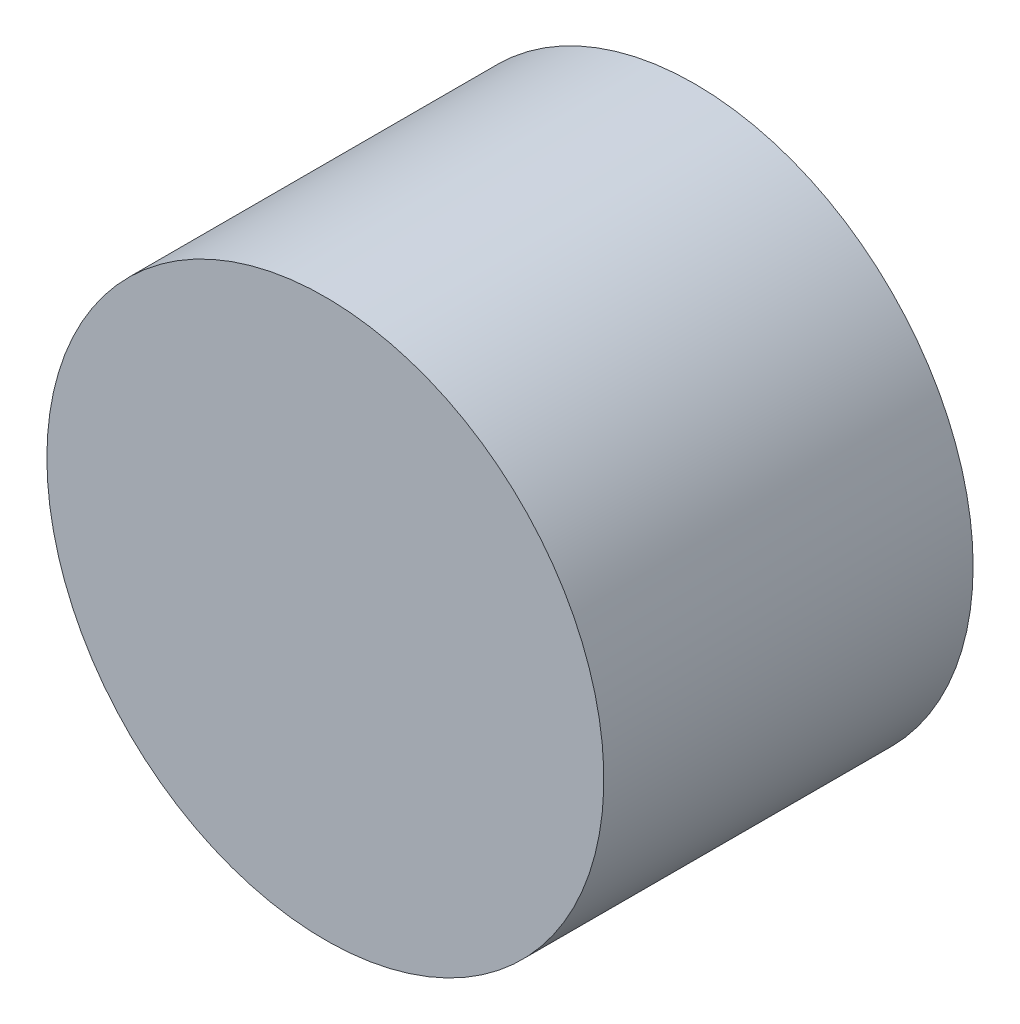
ISO-10303-21;
HEADER;
FILE_DESCRIPTION(('STEP AP214'),'2;1');
FILE_NAME('part.step','',(''),(''),'','','');
FILE_SCHEMA(('AUTOMOTIVE_DESIGN { 1 0 10303 214 1 1 1 1 }'));
ENDSEC;
DATA;
#1=APPLICATION_CONTEXT('core data for automotive mechanical design processes');
#2=APPLICATION_PROTOCOL_DEFINITION('international standard','automotive_design',2000,#1);
#3=PRODUCT_CONTEXT('',#1,'mechanical');
#4=PRODUCT('Part','Part','',(#3));
#5=PRODUCT_RELATED_PRODUCT_CATEGORY('part','',(#4));
#6=PRODUCT_DEFINITION_FORMATION('','',#4);
#7=PRODUCT_DEFINITION_CONTEXT('part definition',#1,'design');
#8=PRODUCT_DEFINITION('design','',#6,#7);
#9=PRODUCT_DEFINITION_SHAPE('','',#8);
#10=(LENGTH_UNIT() NAMED_UNIT(*) SI_UNIT(.MILLI.,.METRE.));
#11=(NAMED_UNIT(*) PLANE_ANGLE_UNIT() SI_UNIT($,.RADIAN.));
#12=(NAMED_UNIT(*) SI_UNIT($,.STERADIAN.) SOLID_ANGLE_UNIT());
#13=UNCERTAINTY_MEASURE_WITH_UNIT(LENGTH_MEASURE(1.E-05),#10,'distance_accuracy_value','');
#14=(GEOMETRIC_REPRESENTATION_CONTEXT(3) GLOBAL_UNCERTAINTY_ASSIGNED_CONTEXT((#13)) GLOBAL_UNIT_ASSIGNED_CONTEXT((#10,
#11,#12)) REPRESENTATION_CONTEXT('',''));
#15=CARTESIAN_POINT('',(0.,0.,0.));
#16=DIRECTION('',(0.,0.,1.));
#17=DIRECTION('',(1.,0.,0.));
#18=AXIS2_PLACEMENT_3D('',#15,#16,#17);
#19=CARTESIAN_POINT('',(-8.76300000000001,-27.305,-1.651));
#20=DIRECTION('',(0.,0.,1.));
#21=DIRECTION('',(1.,0.,0.));
#22=AXIS2_PLACEMENT_3D('',#19,#20,#21);
#23=CYLINDRICAL_SURFACE('',#22,1.778);
#24=CARTESIAN_POINT('',(-8.76300000000001,-27.305,-1.651));
#25=DIRECTION('',(0.,0.,1.));
#26=DIRECTION('',(1.,0.,0.));
#27=AXIS2_PLACEMENT_3D('',#24,#25,#26);
#28=CIRCLE('',#27,1.778);
#29=CARTESIAN_POINT('',(-6.98500000000001,-27.305,-1.651));
#30=VERTEX_POINT('',#29);
#31=EDGE_CURVE('E10',#30,#30,#28,.T.);
#32=CARTESIAN_POINT('',(-8.76300000000001,-27.305,0.));
#33=DIRECTION('',(0.,0.,1.));
#34=DIRECTION('',(1.,0.,0.));
#35=AXIS2_PLACEMENT_3D('',#32,#33,#34);
#36=CIRCLE('',#35,1.778);
#37=CARTESIAN_POINT('',(-6.98500000000001,-27.305,0.));
#38=VERTEX_POINT('',#37);
#39=EDGE_CURVE('E33',#38,#38,#36,.T.);
#40=CARTESIAN_POINT('',(-6.98500000000001,-27.305,-1.651));
#41=CARTESIAN_POINT('',(-6.98500000000001,-27.305,-1.63380208333333));
#42=CARTESIAN_POINT('',(-6.98500000000001,-27.305,-1.61660416666667));
#43=CARTESIAN_POINT('',(-6.98500000000001,-27.305,-1.58220833333333));
#44=CARTESIAN_POINT('',(-6.98500000000001,-27.305,-1.56501041666667));
#45=CARTESIAN_POINT('',(-6.98500000000001,-27.305,-1.53061458333333));
#46=CARTESIAN_POINT('',(-6.98500000000001,-27.305,-1.51341666666667));
#47=CARTESIAN_POINT('',(-6.98500000000001,-27.305,-1.47902083333333));
#48=CARTESIAN_POINT('',(-6.98500000000001,-27.305,-1.46182291666667));
#49=CARTESIAN_POINT('',(-6.98500000000001,-27.305,-1.42742708333333));
#50=CARTESIAN_POINT('',(-6.98500000000001,-27.305,-1.41022916666667));
#51=CARTESIAN_POINT('',(-6.98500000000001,-27.305,-1.37583333333333));
#52=CARTESIAN_POINT('',(-6.98500000000001,-27.305,-1.35863541666667));
#53=CARTESIAN_POINT('',(-6.98500000000001,-27.305,-1.32423958333333));
#54=CARTESIAN_POINT('',(-6.98500000000001,-27.305,-1.30704166666667));
#55=CARTESIAN_POINT('',(-6.98500000000001,-27.305,-1.27264583333333));
#56=CARTESIAN_POINT('',(-6.98500000000001,-27.305,-1.25544791666667));
#57=CARTESIAN_POINT('',(-6.98500000000001,-27.305,-1.22105208333333));
#58=CARTESIAN_POINT('',(-6.98500000000001,-27.305,-1.20385416666667));
#59=CARTESIAN_POINT('',(-6.98500000000001,-27.305,-1.16945833333333));
#60=CARTESIAN_POINT('',(-6.98500000000001,-27.305,-1.15226041666667));
#61=CARTESIAN_POINT('',(-6.98500000000001,-27.305,-1.11786458333333));
#62=CARTESIAN_POINT('',(-6.98500000000001,-27.305,-1.10066666666667));
#63=CARTESIAN_POINT('',(-6.98500000000001,-27.305,-1.06627083333333));
#64=CARTESIAN_POINT('',(-6.98500000000001,-27.305,-1.04907291666667));
#65=CARTESIAN_POINT('',(-6.98500000000001,-27.305,-1.01467708333333));
#66=CARTESIAN_POINT('',(-6.98500000000001,-27.305,-0.997479166666667));
#67=CARTESIAN_POINT('',(-6.98500000000001,-27.305,-0.963083333333333));
#68=CARTESIAN_POINT('',(-6.98500000000001,-27.305,-0.945885416666667));
#69=CARTESIAN_POINT('',(-6.98500000000001,-27.305,-0.911489583333333));
#70=CARTESIAN_POINT('',(-6.98500000000001,-27.305,-0.894291666666667));
#71=CARTESIAN_POINT('',(-6.98500000000001,-27.305,-0.859895833333333));
#72=CARTESIAN_POINT('',(-6.98500000000001,-27.305,-0.842697916666667));
#73=CARTESIAN_POINT('',(-6.98500000000001,-27.305,-0.808302083333333));
#74=CARTESIAN_POINT('',(-6.98500000000001,-27.305,-0.791104166666667));
#75=CARTESIAN_POINT('',(-6.98500000000001,-27.305,-0.756708333333333));
#76=CARTESIAN_POINT('',(-6.98500000000001,-27.305,-0.739510416666667));
#77=CARTESIAN_POINT('',(-6.98500000000001,-27.305,-0.705114583333333));
#78=CARTESIAN_POINT('',(-6.98500000000001,-27.305,-0.687916666666667));
#79=CARTESIAN_POINT('',(-6.98500000000001,-27.305,-0.653520833333333));
#80=CARTESIAN_POINT('',(-6.98500000000001,-27.305,-0.636322916666667));
#81=CARTESIAN_POINT('',(-6.98500000000001,-27.305,-0.601927083333333));
#82=CARTESIAN_POINT('',(-6.98500000000001,-27.305,-0.584729166666667));
#83=CARTESIAN_POINT('',(-6.98500000000001,-27.305,-0.550333333333333));
#84=CARTESIAN_POINT('',(-6.98500000000001,-27.305,-0.533135416666667));
#85=CARTESIAN_POINT('',(-6.98500000000001,-27.305,-0.498739583333333));
#86=CARTESIAN_POINT('',(-6.98500000000001,-27.305,-0.481541666666667));
#87=CARTESIAN_POINT('',(-6.98500000000001,-27.305,-0.447145833333333));
#88=CARTESIAN_POINT('',(-6.98500000000001,-27.305,-0.429947916666667));
#89=CARTESIAN_POINT('',(-6.98500000000001,-27.305,-0.395552083333333));
#90=CARTESIAN_POINT('',(-6.98500000000001,-27.305,-0.378354166666667));
#91=CARTESIAN_POINT('',(-6.98500000000001,-27.305,-0.343958333333333));
#92=CARTESIAN_POINT('',(-6.98500000000001,-27.305,-0.326760416666667));
#93=CARTESIAN_POINT('',(-6.98500000000001,-27.305,-0.292364583333333));
#94=CARTESIAN_POINT('',(-6.98500000000001,-27.305,-0.275166666666667));
#95=CARTESIAN_POINT('',(-6.98500000000001,-27.305,-0.240770833333333));
#96=CARTESIAN_POINT('',(-6.98500000000001,-27.305,-0.223572916666667));
#97=CARTESIAN_POINT('',(-6.98500000000001,-27.305,-0.189177083333333));
#98=CARTESIAN_POINT('',(-6.98500000000001,-27.305,-0.171979166666667));
#99=CARTESIAN_POINT('',(-6.98500000000001,-27.305,-0.137583333333333));
#100=CARTESIAN_POINT('',(-6.98500000000001,-27.305,-0.120385416666667));
#101=CARTESIAN_POINT('',(-6.98500000000001,-27.305,-0.0859895833333333));
#102=CARTESIAN_POINT('',(-6.98500000000001,-27.305,-0.0687916666666667));
#103=CARTESIAN_POINT('',(-6.98500000000001,-27.305,-0.0343958333333333));
#104=CARTESIAN_POINT('',(-6.98500000000001,-27.305,-0.0171979166666666));
#105=CARTESIAN_POINT('',(-6.98500000000001,-27.305,0.));
#106=B_SPLINE_CURVE_WITH_KNOTS('',3,(#40,#41,#42,#43,#44,#45,#46,#47,#48,#49,#50,#51,#52,#53,
#54,#55,#56,#57,#58,#59,#60,#61,#62,#63,#64,#65,#66,#67,#68,#69,#70,#71,#72,#73,#74,#75,#76,#77,
#78,#79,#80,#81,#82,#83,#84,#85,#86,#87,#88,#89,#90,#91,#92,#93,#94,#95,#96,#97,#98,#99,#100,
#101,#102,#103,#104,#105),.UNSPECIFIED.,.F.,.F.,(4,2,2,2,2,2,2,2,2,2,2,2,2,2,2,2,2,2,2,2,2,2,2,
2,2,2,2,2,2,2,2,2,4),(0.,0.05159375,0.1031875,0.15478125,0.206375,0.25796875,0.3095625,
0.36115625,0.41275,0.46434375,0.5159375,0.56753125,0.619125,0.67071875,0.7223125,0.77390625,
0.8255,0.87709375,0.9286875,0.98028125,1.031875,1.08346875,1.1350625,1.18665625,1.23825,
1.28984375,1.3414375,1.39303125,1.444625,1.49621875,1.5478125,1.59940625,1.651),.UNSPECIFIED.);
#107=EDGE_CURVE('BSEAM30',#30,#38,#106,.T.);
#108=ORIENTED_EDGE('',*,*,#31,.T.);
#109=ORIENTED_EDGE('',*,*,#39,.F.);
#110=ORIENTED_EDGE('',*,*,#107,.T.);
#111=ORIENTED_EDGE('',*,*,#107,.F.);
#112=EDGE_LOOP('',(#108,#110,#109,#111));
#113=FACE_BOUND('',#112,.T.);
#114=ADVANCED_FACE('F30',(#113),#23,.T.);
#115=CARTESIAN_POINT('',(-8.76300000000001,-27.305,-1.651));
#116=DIRECTION('',(0.,0.,1.));
#117=DIRECTION('',(1.,0.,0.));
#118=AXIS2_PLACEMENT_3D('',#115,#116,#117);
#119=PLANE('',#118);
#120=ORIENTED_EDGE('',*,*,#31,.F.);
#121=EDGE_LOOP('',(#120));
#122=FACE_BOUND('',#121,.T.);
#123=ADVANCED_FACE('F52',(#122),#119,.F.);
#124=CARTESIAN_POINT('',(-8.76300000000001,-27.305,0.));
#125=DIRECTION('',(0.,0.,1.));
#126=DIRECTION('',(1.,0.,0.));
#127=AXIS2_PLACEMENT_3D('',#124,#125,#126);
#128=PLANE('',#127);
#129=ORIENTED_EDGE('',*,*,#39,.T.);
#130=EDGE_LOOP('',(#129));
#131=FACE_BOUND('',#130,.T.);
#132=CARTESIAN_POINT('',(-8.76300000000001,-27.305,0.));
#133=DIRECTION('',(0.,0.,1.));
#134=DIRECTION('',(1.,0.,0.));
#135=AXIS2_PLACEMENT_3D('',#132,#133,#134);
#136=CIRCLE('',#135,4.40562406974041);
#137=CARTESIAN_POINT('',(-4.3573759302596,-27.305,0.));
#138=VERTEX_POINT('',#137);
#139=EDGE_CURVE('E44',#138,#138,#136,.T.);
#140=ORIENTED_EDGE('',*,*,#139,.F.);
#141=EDGE_LOOP('',(#140));
#142=FACE_BOUND('',#141,.T.);
#143=ADVANCED_FACE('F50',(#131,#142),#128,.F.);
#144=CARTESIAN_POINT('',(-8.76300000000001,-27.305,18.3029866202885));
#145=DIRECTION('',(0.,0.,-1.));
#146=DIRECTION('',(-1.,0.,0.));
#147=AXIS2_PLACEMENT_3D('',#144,#145,#146);
#148=CYLINDRICAL_SURFACE('',#147,4.40562406974041);
#149=CARTESIAN_POINT('',(-8.76300000000001,-27.305,5.84200000000001));
#150=DIRECTION('',(0.,0.,-1.));
#151=DIRECTION('',(-1.,0.,0.));
#152=AXIS2_PLACEMENT_3D('',#149,#150,#151);
#153=CIRCLE('',#152,4.40562406974041);
#154=CARTESIAN_POINT('',(-13.1686240697404,-27.305,5.84200000000001));
#155=VERTEX_POINT('',#154);
#156=EDGE_CURVE('E40',#155,#155,#153,.T.);
#157=ORIENTED_EDGE('',*,*,#156,.T.);
#158=EDGE_LOOP('',(#157));
#159=FACE_BOUND('',#158,.T.);
#160=ORIENTED_EDGE('',*,*,#139,.T.);
#161=EDGE_LOOP('',(#160));
#162=FACE_BOUND('',#161,.T.);
#163=ADVANCED_FACE('F48',(#159,#162),#148,.T.);
#164=CARTESIAN_POINT('',(22.225,-62.23,5.84200000000003));
#165=DIRECTION('',(0.,0.,-1.));
#166=DIRECTION('',(1.,0.,0.));
#167=AXIS2_PLACEMENT_3D('',#164,#165,#166);
#168=PLANE('',#167);
#169=ORIENTED_EDGE('',*,*,#156,.F.);
#170=EDGE_LOOP('',(#169));
#171=FACE_BOUND('',#170,.T.);
#172=ADVANCED_FACE('F59',(#171),#168,.F.);
#173=CLOSED_SHELL('',(#114,#123,#143,#163,#172));
#174=MANIFOLD_SOLID_BREP('B2',#173);
#175=ADVANCED_BREP_SHAPE_REPRESENTATION('',(#18,#174),#14);
#176=SHAPE_DEFINITION_REPRESENTATION(#9,#175);
ENDSEC;
END-ISO-10303-21;
